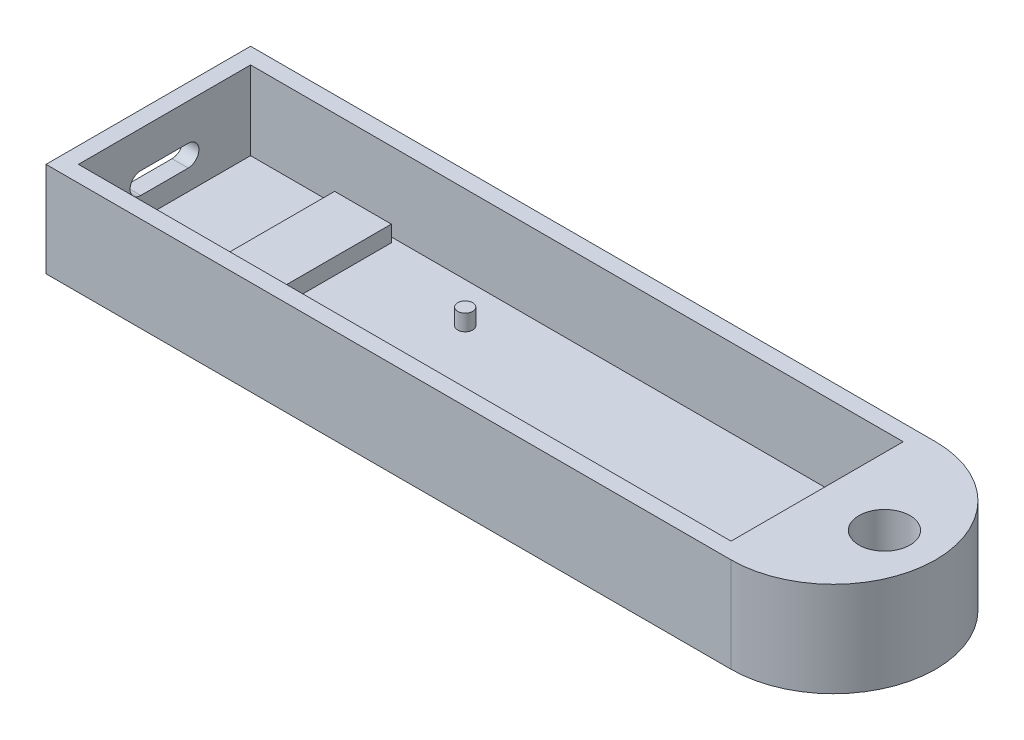
ISO-10303-21;
HEADER;
FILE_DESCRIPTION(('STEP AP214'),'2;1');
FILE_NAME('part.step','',(''),(''),'','','');
FILE_SCHEMA(('AUTOMOTIVE_DESIGN { 1 0 10303 214 1 1 1 1 }'));
ENDSEC;
DATA;
#1=APPLICATION_CONTEXT('core data for automotive mechanical design processes');
#2=APPLICATION_PROTOCOL_DEFINITION('international standard','automotive_design',2000,#1);
#3=PRODUCT_CONTEXT('',#1,'mechanical');
#4=PRODUCT('Part','Part','',(#3));
#5=PRODUCT_RELATED_PRODUCT_CATEGORY('part','',(#4));
#6=PRODUCT_DEFINITION_FORMATION('','',#4);
#7=PRODUCT_DEFINITION_CONTEXT('part definition',#1,'design');
#8=PRODUCT_DEFINITION('design','',#6,#7);
#9=PRODUCT_DEFINITION_SHAPE('','',#8);
#10=(LENGTH_UNIT() NAMED_UNIT(*) SI_UNIT(.MILLI.,.METRE.));
#11=(NAMED_UNIT(*) PLANE_ANGLE_UNIT() SI_UNIT($,.RADIAN.));
#12=(NAMED_UNIT(*) SI_UNIT($,.STERADIAN.) SOLID_ANGLE_UNIT());
#13=UNCERTAINTY_MEASURE_WITH_UNIT(LENGTH_MEASURE(1.E-05),#10,'distance_accuracy_value','');
#14=(GEOMETRIC_REPRESENTATION_CONTEXT(3) GLOBAL_UNCERTAINTY_ASSIGNED_CONTEXT((#13)) GLOBAL_UNIT_ASSIGNED_CONTEXT((#10,
#11,#12)) REPRESENTATION_CONTEXT('',''));
#15=CARTESIAN_POINT('',(0.,0.,0.));
#16=DIRECTION('',(0.,0.,1.));
#17=DIRECTION('',(1.,0.,0.));
#18=AXIS2_PLACEMENT_3D('',#15,#16,#17);
#19=CARTESIAN_POINT('',(-50.2599221877714,11.7,0.));
#20=DIRECTION('',(1.,0.,0.));
#21=DIRECTION('',(0.,0.,-1.));
#22=AXIS2_PLACEMENT_3D('',#19,#20,#21);
#23=PLANE('',#22);
#24=DIRECTION('',(0.,0.,1.));
#25=VECTOR('',#24,1.);
#26=CARTESIAN_POINT('',(-50.2599221877714,0.,0.));
#27=LINE('',#26,#25);
#28=CARTESIAN_POINT('',(-50.2599221877714,0.,-12.5001619157584));
#29=VERTEX_POINT('',#28);
#30=CARTESIAN_POINT('',(-50.2599221877714,0.,12.7498380842416));
#31=VERTEX_POINT('',#30);
#32=EDGE_CURVE('E205',#29,#31,#27,.T.);
#33=ORIENTED_EDGE('',*,*,#32,.T.);
#34=DIRECTION('',(0.,-1.,0.));
#35=VECTOR('',#34,1.);
#36=CARTESIAN_POINT('',(-50.2599221877714,11.7,12.7498380842416));
#37=LINE('',#36,#35);
#38=CARTESIAN_POINT('',(-50.2599221877714,11.7,12.7498380842416));
#39=VERTEX_POINT('',#38);
#40=EDGE_CURVE('E209',#39,#31,#37,.T.);
#41=ORIENTED_EDGE('',*,*,#40,.F.);
#42=DIRECTION('',(0.,0.,1.));
#43=VECTOR('',#42,1.);
#44=CARTESIAN_POINT('',(-50.2599221877714,11.7,0.));
#45=LINE('',#44,#43);
#46=CARTESIAN_POINT('',(-50.2599221877714,11.7,-12.5001619157584));
#47=VERTEX_POINT('',#46);
#48=EDGE_CURVE('E194',#47,#39,#45,.T.);
#49=ORIENTED_EDGE('',*,*,#48,.F.);
#50=DIRECTION('',(0.,-1.,0.));
#51=VECTOR('',#50,1.);
#52=CARTESIAN_POINT('',(-50.2599221877714,11.7,-12.5001619157584));
#53=LINE('',#52,#51);
#54=EDGE_CURVE('E212',#47,#29,#53,.T.);
#55=ORIENTED_EDGE('',*,*,#54,.T.);
#56=EDGE_LOOP('',(#33,#41,#49,#55));
#57=FACE_BOUND('',#56,.T.);
#58=CARTESIAN_POINT('',(-50.2599221877714,5.85,-2.80016191575837));
#59=DIRECTION('',(1.,0.,0.));
#60=DIRECTION('',(0.,0.,-1.));
#61=AXIS2_PLACEMENT_3D('',#58,#59,#60);
#62=CIRCLE('',#61,1.325);
#63=CARTESIAN_POINT('',(-50.2599221877714,7.175,-2.80016191575837));
#64=VERTEX_POINT('',#63);
#65=CARTESIAN_POINT('',(-50.2599221877714,4.525,-2.80016191575837));
#66=VERTEX_POINT('',#65);
#67=EDGE_CURVE('E160',#64,#66,#62,.F.);
#68=ORIENTED_EDGE('',*,*,#67,.F.);
#69=DIRECTION('',(0.,0.,1.));
#70=VECTOR('',#69,1.);
#71=CARTESIAN_POINT('',(-50.2599221877714,7.175,0.));
#72=LINE('',#71,#70);
#73=CARTESIAN_POINT('',(-50.2599221877714,7.175,3.04983808424164));
#74=VERTEX_POINT('',#73);
#75=EDGE_CURVE('E149',#64,#74,#72,.T.);
#76=ORIENTED_EDGE('',*,*,#75,.T.);
#77=CARTESIAN_POINT('',(-50.2599221877714,5.85,3.04983808424163));
#78=DIRECTION('',(1.,0.,0.));
#79=DIRECTION('',(0.,0.,-1.));
#80=AXIS2_PLACEMENT_3D('',#77,#78,#79);
#81=CIRCLE('',#80,1.325);
#82=CARTESIAN_POINT('',(-50.2599221877714,4.525,3.04983808424164));
#83=VERTEX_POINT('',#82);
#84=EDGE_CURVE('E154',#83,#74,#81,.F.);
#85=ORIENTED_EDGE('',*,*,#84,.F.);
#86=DIRECTION('',(0.,0.,1.));
#87=VECTOR('',#86,1.);
#88=CARTESIAN_POINT('',(-50.2599221877714,4.525,0.));
#89=LINE('',#88,#87);
#90=EDGE_CURVE('E165',#66,#83,#89,.T.);
#91=ORIENTED_EDGE('',*,*,#90,.F.);
#92=EDGE_LOOP('',(#68,#76,#85,#91));
#93=FACE_BOUND('',#92,.T.);
#94=ADVANCED_FACE('F39',(#57,#93),#23,.F.);
#95=CARTESIAN_POINT('',(-48.2599221877714,11.7,0.));
#96=DIRECTION('',(1.,0.,0.));
#97=DIRECTION('',(0.,0.,-1.));
#98=AXIS2_PLACEMENT_3D('',#95,#96,#97);
#99=PLANE('',#98);
#100=DIRECTION('',(0.,-1.,0.));
#101=VECTOR('',#100,1.);
#102=CARTESIAN_POINT('',(-48.2599221877714,11.7,10.7498380842416));
#103=LINE('',#102,#101);
#104=CARTESIAN_POINT('',(-48.2599221877714,11.7,10.7498380842416));
#105=VERTEX_POINT('',#104);
#106=CARTESIAN_POINT('',(-48.2599221877714,2.,10.7498380842416));
#107=VERTEX_POINT('',#106);
#108=EDGE_CURVE('E223',#105,#107,#103,.T.);
#109=ORIENTED_EDGE('',*,*,#108,.T.);
#110=DIRECTION('',(0.,0.,1.));
#111=VECTOR('',#110,1.);
#112=CARTESIAN_POINT('',(-48.2599221877714,2.,0.));
#113=LINE('',#112,#111);
#114=CARTESIAN_POINT('',(-48.2599221877714,2.,-10.5001619157584));
#115=VERTEX_POINT('',#114);
#116=EDGE_CURVE('E254',#115,#107,#113,.T.);
#117=ORIENTED_EDGE('',*,*,#116,.F.);
#118=DIRECTION('',(0.,-1.,0.));
#119=VECTOR('',#118,1.);
#120=CARTESIAN_POINT('',(-48.2599221877714,11.7,-10.5001619157584));
#121=LINE('',#120,#119);
#122=CARTESIAN_POINT('',(-48.2599221877714,11.7,-10.5001619157584));
#123=VERTEX_POINT('',#122);
#124=EDGE_CURVE('E198',#123,#115,#121,.T.);
#125=ORIENTED_EDGE('',*,*,#124,.F.);
#126=DIRECTION('',(0.,0.,1.));
#127=VECTOR('',#126,1.);
#128=CARTESIAN_POINT('',(-48.2599221877714,11.7,0.));
#129=LINE('',#128,#127);
#130=EDGE_CURVE('E183',#123,#105,#129,.T.);
#131=ORIENTED_EDGE('',*,*,#130,.T.);
#132=EDGE_LOOP('',(#109,#117,#125,#131));
#133=FACE_BOUND('',#132,.T.);
#134=DIRECTION('',(0.,0.,1.));
#135=VECTOR('',#134,1.);
#136=CARTESIAN_POINT('',(-48.2599221877714,7.175,0.));
#137=LINE('',#136,#135);
#138=CARTESIAN_POINT('',(-48.2599221877714,7.175,-2.80016191575837));
#139=VERTEX_POINT('',#138);
#140=CARTESIAN_POINT('',(-48.2599221877714,7.175,3.04983808424164));
#141=VERTEX_POINT('',#140);
#142=EDGE_CURVE('E295',#139,#141,#137,.T.);
#143=ORIENTED_EDGE('',*,*,#142,.F.);
#144=CARTESIAN_POINT('',(-48.2599221877714,5.85,-2.80016191575837));
#145=DIRECTION('',(1.,0.,0.));
#146=DIRECTION('',(0.,0.,-1.));
#147=AXIS2_PLACEMENT_3D('',#144,#145,#146);
#148=CIRCLE('',#147,1.325);
#149=CARTESIAN_POINT('',(-48.2599221877714,4.525,-2.80016191575837));
#150=VERTEX_POINT('',#149);
#151=EDGE_CURVE('E11',#139,#150,#148,.F.);
#152=ORIENTED_EDGE('',*,*,#151,.T.);
#153=DIRECTION('',(0.,0.,1.));
#154=VECTOR('',#153,1.);
#155=CARTESIAN_POINT('',(-48.2599221877714,4.525,0.));
#156=LINE('',#155,#154);
#157=CARTESIAN_POINT('',(-48.2599221877714,4.525,3.04983808424164));
#158=VERTEX_POINT('',#157);
#159=EDGE_CURVE('E47',#150,#158,#156,.T.);
#160=ORIENTED_EDGE('',*,*,#159,.T.);
#161=CARTESIAN_POINT('',(-48.2599221877714,5.85,3.04983808424163));
#162=DIRECTION('',(1.,0.,0.));
#163=DIRECTION('',(0.,0.,-1.));
#164=AXIS2_PLACEMENT_3D('',#161,#162,#163);
#165=CIRCLE('',#164,1.325);
#166=EDGE_CURVE('E297',#158,#141,#165,.F.);
#167=ORIENTED_EDGE('',*,*,#166,.T.);
#168=EDGE_LOOP('',(#143,#152,#160,#167));
#169=FACE_BOUND('',#168,.T.);
#170=ADVANCED_FACE('F301',(#133,#169),#99,.T.);
#171=CARTESIAN_POINT('',(0.,4.,10.1248380842416));
#172=DIRECTION('',(0.,0.,-1.));
#173=DIRECTION('',(-1.,0.,0.));
#174=AXIS2_PLACEMENT_3D('',#171,#172,#173);
#175=PLANE('',#174);
#176=DIRECTION('',(0.,-1.,0.));
#177=VECTOR('',#176,1.);
#178=CARTESIAN_POINT('',(-37.2599221877714,4.,10.1248380842416));
#179=LINE('',#178,#177);
#180=CARTESIAN_POINT('',(-37.2599221877714,4.,10.1248380842416));
#181=VERTEX_POINT('',#180);
#182=CARTESIAN_POINT('',(-37.2599221877714,2.,10.1248380842416));
#183=VERTEX_POINT('',#182);
#184=EDGE_CURVE('E284',#181,#183,#179,.T.);
#185=ORIENTED_EDGE('',*,*,#184,.T.);
#186=DIRECTION('',(1.,0.,0.));
#187=VECTOR('',#186,1.);
#188=CARTESIAN_POINT('',(0.,2.,10.1248380842416));
#189=LINE('',#188,#187);
#190=CARTESIAN_POINT('',(-30.2599221877714,2.,10.1248380842416));
#191=VERTEX_POINT('',#190);
#192=EDGE_CURVE('E259',#183,#191,#189,.T.);
#193=ORIENTED_EDGE('',*,*,#192,.T.);
#194=DIRECTION('',(0.,-1.,0.));
#195=VECTOR('',#194,1.);
#196=CARTESIAN_POINT('',(-30.2599221877714,4.,10.1248380842416));
#197=LINE('',#196,#195);
#198=CARTESIAN_POINT('',(-30.2599221877714,4.,10.1248380842416));
#199=VERTEX_POINT('',#198);
#200=EDGE_CURVE('E292',#199,#191,#197,.T.);
#201=ORIENTED_EDGE('',*,*,#200,.F.);
#202=DIRECTION('',(1.,0.,0.));
#203=VECTOR('',#202,1.);
#204=CARTESIAN_POINT('',(0.,4.,10.1248380842416));
#205=LINE('',#204,#203);
#206=EDGE_CURVE('E273',#181,#199,#205,.T.);
#207=ORIENTED_EDGE('',*,*,#206,.F.);
#208=EDGE_LOOP('',(#185,#193,#201,#207));
#209=FACE_BOUND('',#208,.T.);
#210=ADVANCED_FACE('F41',(#209),#175,.F.);
#211=CARTESIAN_POINT('',(-30.2599221877714,4.,0.));
#212=DIRECTION('',(-1.,0.,0.));
#213=DIRECTION('',(0.,0.,1.));
#214=AXIS2_PLACEMENT_3D('',#211,#212,#213);
#215=PLANE('',#214);
#216=ORIENTED_EDGE('',*,*,#200,.T.);
#217=DIRECTION('',(0.,0.,-1.));
#218=VECTOR('',#217,1.);
#219=CARTESIAN_POINT('',(-30.2599221877714,2.,0.));
#220=LINE('',#219,#218);
#221=CARTESIAN_POINT('',(-30.2599221877714,2.,-9.87516191575836));
#222=VERTEX_POINT('',#221);
#223=EDGE_CURVE('E257',#191,#222,#220,.T.);
#224=ORIENTED_EDGE('',*,*,#223,.T.);
#225=DIRECTION('',(0.,-1.,0.));
#226=VECTOR('',#225,1.);
#227=CARTESIAN_POINT('',(-30.2599221877714,4.,-9.87516191575836));
#228=LINE('',#227,#226);
#229=CARTESIAN_POINT('',(-30.2599221877714,4.,-9.87516191575836));
#230=VERTEX_POINT('',#229);
#231=EDGE_CURVE('E289',#230,#222,#228,.T.);
#232=ORIENTED_EDGE('',*,*,#231,.F.);
#233=DIRECTION('',(0.,0.,-1.));
#234=VECTOR('',#233,1.);
#235=CARTESIAN_POINT('',(-30.2599221877714,4.,0.));
#236=LINE('',#235,#234);
#237=EDGE_CURVE('E276',#199,#230,#236,.T.);
#238=ORIENTED_EDGE('',*,*,#237,.F.);
#239=EDGE_LOOP('',(#216,#224,#232,#238));
#240=FACE_BOUND('',#239,.T.);
#241=ADVANCED_FACE('F407',(#240),#215,.F.);
#242=CARTESIAN_POINT('',(0.,4.,-9.87516191575836));
#243=DIRECTION('',(0.,0.,-1.));
#244=DIRECTION('',(-1.,0.,0.));
#245=AXIS2_PLACEMENT_3D('',#242,#243,#244);
#246=PLANE('',#245);
#247=DIRECTION('',(1.,0.,0.));
#248=VECTOR('',#247,1.);
#249=CARTESIAN_POINT('',(0.,2.,-9.87516191575836));
#250=LINE('',#249,#248);
#251=CARTESIAN_POINT('',(-37.2599221877714,2.,-9.87516191575836));
#252=VERTEX_POINT('',#251);
#253=EDGE_CURVE('E264',#252,#222,#250,.T.);
#254=ORIENTED_EDGE('',*,*,#253,.F.);
#255=DIRECTION('',(0.,-1.,0.));
#256=VECTOR('',#255,1.);
#257=CARTESIAN_POINT('',(-37.2599221877714,4.,-9.87516191575836));
#258=LINE('',#257,#256);
#259=CARTESIAN_POINT('',(-37.2599221877714,4.,-9.87516191575836));
#260=VERTEX_POINT('',#259);
#261=EDGE_CURVE('E287',#260,#252,#258,.T.);
#262=ORIENTED_EDGE('',*,*,#261,.F.);
#263=DIRECTION('',(1.,0.,0.));
#264=VECTOR('',#263,1.);
#265=CARTESIAN_POINT('',(0.,4.,-9.87516191575836));
#266=LINE('',#265,#264);
#267=EDGE_CURVE('E278',#260,#230,#266,.T.);
#268=ORIENTED_EDGE('',*,*,#267,.T.);
#269=ORIENTED_EDGE('',*,*,#231,.T.);
#270=EDGE_LOOP('',(#254,#262,#268,#269));
#271=FACE_BOUND('',#270,.T.);
#272=ADVANCED_FACE('F404',(#271),#246,.T.);
#273=CARTESIAN_POINT('',(-37.2599221877714,4.,0.));
#274=DIRECTION('',(-1.,0.,0.));
#275=DIRECTION('',(0.,0.,1.));
#276=AXIS2_PLACEMENT_3D('',#273,#274,#275);
#277=PLANE('',#276);
#278=DIRECTION('',(0.,0.,-1.));
#279=VECTOR('',#278,1.);
#280=CARTESIAN_POINT('',(-37.2599221877714,2.,0.));
#281=LINE('',#280,#279);
#282=EDGE_CURVE('E261',#183,#252,#281,.T.);
#283=ORIENTED_EDGE('',*,*,#282,.F.);
#284=ORIENTED_EDGE('',*,*,#184,.F.);
#285=DIRECTION('',(0.,0.,-1.));
#286=VECTOR('',#285,1.);
#287=CARTESIAN_POINT('',(-37.2599221877714,4.,0.));
#288=LINE('',#287,#286);
#289=EDGE_CURVE('E281',#181,#260,#288,.T.);
#290=ORIENTED_EDGE('',*,*,#289,.T.);
#291=ORIENTED_EDGE('',*,*,#261,.T.);
#292=EDGE_LOOP('',(#283,#284,#290,#291));
#293=FACE_BOUND('',#292,.T.);
#294=ADVANCED_FACE('F396',(#293),#277,.T.);
#295=CARTESIAN_POINT('',(0.,4.,0.));
#296=DIRECTION('',(0.,1.,0.));
#297=DIRECTION('',(0.,0.,1.));
#298=AXIS2_PLACEMENT_3D('',#295,#296,#297);
#299=PLANE('',#298);
#300=ORIENTED_EDGE('',*,*,#206,.T.);
#301=ORIENTED_EDGE('',*,*,#237,.T.);
#302=ORIENTED_EDGE('',*,*,#267,.F.);
#303=ORIENTED_EDGE('',*,*,#289,.F.);
#304=EDGE_LOOP('',(#300,#301,#302,#303));
#305=FACE_BOUND('',#304,.T.);
#306=ADVANCED_FACE('F392',(#305),#299,.T.);
#307=CARTESIAN_POINT('',(0.,2.,0.));
#308=DIRECTION('',(0.,1.,0.));
#309=DIRECTION('',(0.,0.,1.));
#310=AXIS2_PLACEMENT_3D('',#307,#308,#309);
#311=PLANE('',#310);
#312=CARTESIAN_POINT('',(-16.8399221877714,2.,7.38135930462612));
#313=DIRECTION('',(0.,1.,0.));
#314=DIRECTION('',(0.,0.,1.));
#315=AXIS2_PLACEMENT_3D('',#312,#313,#314);
#316=CIRCLE('',#315,0.925000000000002);
#317=CARTESIAN_POINT('',(-16.8399221877714,2.,8.30635930462612));
#318=VERTEX_POINT('',#317);
#319=EDGE_CURVE('E241',#318,#318,#316,.T.);
#320=ORIENTED_EDGE('',*,*,#319,.F.);
#321=EDGE_LOOP('',(#320));
#322=FACE_BOUND('',#321,.T.);
#323=CARTESIAN_POINT('',(-16.8399221877714,2.,-5.57016191575837));
#324=DIRECTION('',(0.,1.,0.));
#325=DIRECTION('',(0.,0.,1.));
#326=AXIS2_PLACEMENT_3D('',#323,#324,#325);
#327=CIRCLE('',#326,0.925000000000002);
#328=CARTESIAN_POINT('',(-16.8399221877714,2.,-4.64516191575836));
#329=VERTEX_POINT('',#328);
#330=EDGE_CURVE('E244',#329,#329,#327,.T.);
#331=ORIENTED_EDGE('',*,*,#330,.F.);
#332=EDGE_LOOP('',(#331));
#333=FACE_BOUND('',#332,.T.);
#334=DIRECTION('',(1.,0.,0.));
#335=VECTOR('',#334,1.);
#336=CARTESIAN_POINT('',(0.,2.,10.7498380842416));
#337=LINE('',#336,#335);
#338=CARTESIAN_POINT('',(32.2900778122286,2.,10.7498380842416));
#339=VERTEX_POINT('',#338);
#340=EDGE_CURVE('E247',#107,#339,#337,.T.);
#341=ORIENTED_EDGE('',*,*,#340,.T.);
#342=DIRECTION('',(0.,0.,1.));
#343=VECTOR('',#342,1.);
#344=CARTESIAN_POINT('',(32.2900778122286,2.,0.));
#345=LINE('',#344,#343);
#346=CARTESIAN_POINT('',(32.2900778122286,2.,-10.5001619157584));
#347=VERTEX_POINT('',#346);
#348=EDGE_CURVE('E250',#347,#339,#345,.T.);
#349=ORIENTED_EDGE('',*,*,#348,.F.);
#350=DIRECTION('',(1.,0.,0.));
#351=VECTOR('',#350,1.);
#352=CARTESIAN_POINT('',(0.,2.,-10.5001619157584));
#353=LINE('',#352,#351);
#354=EDGE_CURVE('E252',#115,#347,#353,.T.);
#355=ORIENTED_EDGE('',*,*,#354,.F.);
#356=ORIENTED_EDGE('',*,*,#116,.T.);
#357=EDGE_LOOP('',(#341,#349,#355,#356));
#358=FACE_BOUND('',#357,.T.);
#359=ORIENTED_EDGE('',*,*,#223,.F.);
#360=ORIENTED_EDGE('',*,*,#192,.F.);
#361=ORIENTED_EDGE('',*,*,#282,.T.);
#362=ORIENTED_EDGE('',*,*,#253,.T.);
#363=EDGE_LOOP('',(#359,#360,#361,#362));
#364=FACE_BOUND('',#363,.T.);
#365=CARTESIAN_POINT('',(30.1600778122286,2.,-5.57016191575837));
#366=DIRECTION('',(0.,1.,0.));
#367=DIRECTION('',(0.,0.,1.));
#368=AXIS2_PLACEMENT_3D('',#365,#366,#367);
#369=CIRCLE('',#368,0.925000000000002);
#370=CARTESIAN_POINT('',(30.1600778122286,2.,-4.64516191575836));
#371=VERTEX_POINT('',#370);
#372=EDGE_CURVE('E267',#371,#371,#369,.T.);
#373=ORIENTED_EDGE('',*,*,#372,.F.);
#374=EDGE_LOOP('',(#373));
#375=FACE_BOUND('',#374,.T.);
#376=CARTESIAN_POINT('',(30.1600778122286,2.,7.38135930462612));
#377=DIRECTION('',(0.,1.,0.));
#378=DIRECTION('',(0.,0.,1.));
#379=AXIS2_PLACEMENT_3D('',#376,#377,#378);
#380=CIRCLE('',#379,0.925000000000002);
#381=CARTESIAN_POINT('',(30.1600778122286,2.,8.30635930462612));
#382=VERTEX_POINT('',#381);
#383=EDGE_CURVE('E270',#382,#382,#380,.T.);
#384=ORIENTED_EDGE('',*,*,#383,.F.);
#385=EDGE_LOOP('',(#384));
#386=FACE_BOUND('',#385,.T.);
#387=ADVANCED_FACE('F388',(#322,#333,#358,#364,#375,#386),#311,.T.);
#388=CARTESIAN_POINT('',(-16.8399221877714,4.,-5.57016191575837));
#389=DIRECTION('',(0.,-1.,0.));
#390=DIRECTION('',(0.,0.,-1.));
#391=AXIS2_PLACEMENT_3D('',#388,#389,#390);
#392=CYLINDRICAL_SURFACE('',#391,0.925000000000002);
#393=ORIENTED_EDGE('',*,*,#330,.T.);
#394=EDGE_LOOP('',(#393));
#395=FACE_BOUND('',#394,.T.);
#396=CARTESIAN_POINT('',(-16.8399221877714,4.,-5.57016191575837));
#397=DIRECTION('',(0.,1.,0.));
#398=DIRECTION('',(0.,0.,1.));
#399=AXIS2_PLACEMENT_3D('',#396,#397,#398);
#400=CIRCLE('',#399,0.925000000000002);
#401=CARTESIAN_POINT('',(-16.8399221877714,4.,-4.64516191575836));
#402=VERTEX_POINT('',#401);
#403=EDGE_CURVE('E238',#402,#402,#400,.T.);
#404=ORIENTED_EDGE('',*,*,#403,.F.);
#405=EDGE_LOOP('',(#404));
#406=FACE_BOUND('',#405,.T.);
#407=ADVANCED_FACE('F384',(#395,#406),#392,.T.);
#408=CARTESIAN_POINT('',(-16.8399221877714,4.,-5.57016191575837));
#409=DIRECTION('',(0.,1.,0.));
#410=DIRECTION('',(0.,0.,1.));
#411=AXIS2_PLACEMENT_3D('',#408,#409,#410);
#412=PLANE('',#411);
#413=ORIENTED_EDGE('',*,*,#403,.T.);
#414=EDGE_LOOP('',(#413));
#415=FACE_BOUND('',#414,.T.);
#416=ADVANCED_FACE('F377',(#415),#412,.T.);
#417=CARTESIAN_POINT('',(-16.8399221877714,4.,7.38135930462612));
#418=DIRECTION('',(0.,-1.,0.));
#419=DIRECTION('',(0.,0.,-1.));
#420=AXIS2_PLACEMENT_3D('',#417,#418,#419);
#421=CYLINDRICAL_SURFACE('',#420,0.925000000000002);
#422=ORIENTED_EDGE('',*,*,#319,.T.);
#423=EDGE_LOOP('',(#422));
#424=FACE_BOUND('',#423,.T.);
#425=CARTESIAN_POINT('',(-16.8399221877714,4.,7.38135930462612));
#426=DIRECTION('',(0.,1.,0.));
#427=DIRECTION('',(0.,0.,1.));
#428=AXIS2_PLACEMENT_3D('',#425,#426,#427);
#429=CIRCLE('',#428,0.925000000000002);
#430=CARTESIAN_POINT('',(-16.8399221877714,4.,8.30635930462612));
#431=VERTEX_POINT('',#430);
#432=EDGE_CURVE('E235',#431,#431,#429,.T.);
#433=ORIENTED_EDGE('',*,*,#432,.F.);
#434=EDGE_LOOP('',(#433));
#435=FACE_BOUND('',#434,.T.);
#436=ADVANCED_FACE('F374',(#424,#435),#421,.T.);
#437=CARTESIAN_POINT('',(-16.8399221877714,4.,7.38135930462612));
#438=DIRECTION('',(0.,1.,0.));
#439=DIRECTION('',(0.,0.,1.));
#440=AXIS2_PLACEMENT_3D('',#437,#438,#439);
#441=PLANE('',#440);
#442=ORIENTED_EDGE('',*,*,#432,.T.);
#443=EDGE_LOOP('',(#442));
#444=FACE_BOUND('',#443,.T.);
#445=ADVANCED_FACE('F369',(#444),#441,.T.);
#446=CARTESIAN_POINT('',(30.1600778122286,4.,7.38135930462612));
#447=DIRECTION('',(0.,-1.,0.));
#448=DIRECTION('',(0.,0.,-1.));
#449=AXIS2_PLACEMENT_3D('',#446,#447,#448);
#450=CYLINDRICAL_SURFACE('',#449,0.925000000000002);
#451=ORIENTED_EDGE('',*,*,#383,.T.);
#452=EDGE_LOOP('',(#451));
#453=FACE_BOUND('',#452,.T.);
#454=CARTESIAN_POINT('',(30.1600778122286,4.,7.38135930462612));
#455=DIRECTION('',(0.,1.,0.));
#456=DIRECTION('',(0.,0.,1.));
#457=AXIS2_PLACEMENT_3D('',#454,#455,#456);
#458=CIRCLE('',#457,0.925000000000002);
#459=CARTESIAN_POINT('',(30.1600778122286,4.,8.30635930462612));
#460=VERTEX_POINT('',#459);
#461=EDGE_CURVE('E232',#460,#460,#458,.T.);
#462=ORIENTED_EDGE('',*,*,#461,.F.);
#463=EDGE_LOOP('',(#462));
#464=FACE_BOUND('',#463,.T.);
#465=ADVANCED_FACE('F366',(#453,#464),#450,.T.);
#466=CARTESIAN_POINT('',(30.1600778122286,4.,7.38135930462612));
#467=DIRECTION('',(0.,1.,0.));
#468=DIRECTION('',(0.,0.,1.));
#469=AXIS2_PLACEMENT_3D('',#466,#467,#468);
#470=PLANE('',#469);
#471=ORIENTED_EDGE('',*,*,#461,.T.);
#472=EDGE_LOOP('',(#471));
#473=FACE_BOUND('',#472,.T.);
#474=ADVANCED_FACE('F361',(#473),#470,.T.);
#475=CARTESIAN_POINT('',(30.1600778122286,4.,-5.57016191575837));
#476=DIRECTION('',(0.,-1.,0.));
#477=DIRECTION('',(0.,0.,-1.));
#478=AXIS2_PLACEMENT_3D('',#475,#476,#477);
#479=CYLINDRICAL_SURFACE('',#478,0.925000000000002);
#480=ORIENTED_EDGE('',*,*,#372,.T.);
#481=EDGE_LOOP('',(#480));
#482=FACE_BOUND('',#481,.T.);
#483=CARTESIAN_POINT('',(30.1600778122286,4.,-5.57016191575837));
#484=DIRECTION('',(0.,1.,0.));
#485=DIRECTION('',(0.,0.,1.));
#486=AXIS2_PLACEMENT_3D('',#483,#484,#485);
#487=CIRCLE('',#486,0.925000000000002);
#488=CARTESIAN_POINT('',(30.1600778122286,4.,-4.64516191575836));
#489=VERTEX_POINT('',#488);
#490=EDGE_CURVE('E220',#489,#489,#487,.T.);
#491=ORIENTED_EDGE('',*,*,#490,.F.);
#492=EDGE_LOOP('',(#491));
#493=FACE_BOUND('',#492,.T.);
#494=ADVANCED_FACE('F358',(#482,#493),#479,.T.);
#495=CARTESIAN_POINT('',(30.1600778122286,4.,-5.57016191575837));
#496=DIRECTION('',(0.,1.,0.));
#497=DIRECTION('',(0.,0.,1.));
#498=AXIS2_PLACEMENT_3D('',#495,#496,#497);
#499=PLANE('',#498);
#500=ORIENTED_EDGE('',*,*,#490,.T.);
#501=EDGE_LOOP('',(#500));
#502=FACE_BOUND('',#501,.T.);
#503=ADVANCED_FACE('F344',(#502),#499,.T.);
#504=CARTESIAN_POINT('',(0.,11.7,12.7498380842416));
#505=DIRECTION('',(0.,0.,-1.));
#506=DIRECTION('',(-1.,0.,0.));
#507=AXIS2_PLACEMENT_3D('',#504,#505,#506);
#508=PLANE('',#507);
#509=DIRECTION('',(1.,0.,0.));
#510=VECTOR('',#509,1.);
#511=CARTESIAN_POINT('',(0.,0.,12.7498380842416));
#512=LINE('',#511,#510);
#513=CARTESIAN_POINT('',(34.2900778122286,0.,12.7498380842416));
#514=VERTEX_POINT('',#513);
#515=EDGE_CURVE('E166',#31,#514,#512,.T.);
#516=ORIENTED_EDGE('',*,*,#515,.T.);
#517=DIRECTION('',(0.,-1.,0.));
#518=VECTOR('',#517,1.);
#519=CARTESIAN_POINT('',(34.2900778122286,11.7,12.7498380842416));
#520=LINE('',#519,#518);
#521=CARTESIAN_POINT('',(34.2900778122286,11.7,12.7498380842416));
#522=VERTEX_POINT('',#521);
#523=EDGE_CURVE('E217',#522,#514,#520,.T.);
#524=ORIENTED_EDGE('',*,*,#523,.F.);
#525=DIRECTION('',(1.,0.,0.));
#526=VECTOR('',#525,1.);
#527=CARTESIAN_POINT('',(0.,11.7,12.7498380842416));
#528=LINE('',#527,#526);
#529=EDGE_CURVE('E186',#39,#522,#528,.T.);
#530=ORIENTED_EDGE('',*,*,#529,.F.);
#531=ORIENTED_EDGE('',*,*,#40,.T.);
#532=EDGE_LOOP('',(#516,#524,#530,#531));
#533=FACE_BOUND('',#532,.T.);
#534=ADVANCED_FACE('F341',(#533),#508,.F.);
#535=CARTESIAN_POINT('',(34.2900778122286,11.7,0.124838084241635));
#536=DIRECTION('',(0.,-1.,0.));
#537=DIRECTION('',(0.,0.,-1.));
#538=AXIS2_PLACEMENT_3D('',#535,#536,#537);
#539=CYLINDRICAL_SURFACE('',#538,12.625);
#540=CARTESIAN_POINT('',(34.2900778122286,0.,0.124838084241635));
#541=DIRECTION('',(0.,1.,0.));
#542=DIRECTION('',(0.,0.,1.));
#543=AXIS2_PLACEMENT_3D('',#540,#541,#542);
#544=CIRCLE('',#543,12.625);
#545=CARTESIAN_POINT('',(34.2900778122286,0.,-12.5001619157584));
#546=VERTEX_POINT('',#545);
#547=EDGE_CURVE('E169',#514,#546,#544,.T.);
#548=ORIENTED_EDGE('',*,*,#547,.T.);
#549=DIRECTION('',(0.,-1.,0.));
#550=VECTOR('',#549,1.);
#551=CARTESIAN_POINT('',(34.2900778122286,11.7,-12.5001619157584));
#552=LINE('',#551,#550);
#553=CARTESIAN_POINT('',(34.2900778122286,11.7,-12.5001619157584));
#554=VERTEX_POINT('',#553);
#555=EDGE_CURVE('E215',#554,#546,#552,.T.);
#556=ORIENTED_EDGE('',*,*,#555,.F.);
#557=CARTESIAN_POINT('',(34.2900778122286,11.7,0.124838084241635));
#558=DIRECTION('',(0.,1.,0.));
#559=DIRECTION('',(0.,0.,1.));
#560=AXIS2_PLACEMENT_3D('',#557,#558,#559);
#561=CIRCLE('',#560,12.625);
#562=EDGE_CURVE('E189',#522,#554,#561,.T.);
#563=ORIENTED_EDGE('',*,*,#562,.F.);
#564=ORIENTED_EDGE('',*,*,#523,.T.);
#565=EDGE_LOOP('',(#548,#556,#563,#564));
#566=FACE_BOUND('',#565,.T.);
#567=ADVANCED_FACE('F337',(#566),#539,.T.);
#568=CARTESIAN_POINT('',(0.,11.7,-12.5001619157584));
#569=DIRECTION('',(0.,0.,-1.));
#570=DIRECTION('',(-1.,0.,0.));
#571=AXIS2_PLACEMENT_3D('',#568,#569,#570);
#572=PLANE('',#571);
#573=DIRECTION('',(1.,0.,0.));
#574=VECTOR('',#573,1.);
#575=CARTESIAN_POINT('',(0.,0.,-12.5001619157584));
#576=LINE('',#575,#574);
#577=EDGE_CURVE('E202',#29,#546,#576,.T.);
#578=ORIENTED_EDGE('',*,*,#577,.F.);
#579=ORIENTED_EDGE('',*,*,#54,.F.);
#580=DIRECTION('',(1.,0.,0.));
#581=VECTOR('',#580,1.);
#582=CARTESIAN_POINT('',(0.,11.7,-12.5001619157584));
#583=LINE('',#582,#581);
#584=EDGE_CURVE('E191',#47,#554,#583,.T.);
#585=ORIENTED_EDGE('',*,*,#584,.T.);
#586=ORIENTED_EDGE('',*,*,#555,.T.);
#587=EDGE_LOOP('',(#578,#579,#585,#586));
#588=FACE_BOUND('',#587,.T.);
#589=ADVANCED_FACE('F333',(#588),#572,.T.);
#590=CARTESIAN_POINT('',(0.,11.7,-10.5001619157584));
#591=DIRECTION('',(0.,0.,-1.));
#592=DIRECTION('',(-1.,0.,0.));
#593=AXIS2_PLACEMENT_3D('',#590,#591,#592);
#594=PLANE('',#593);
#595=ORIENTED_EDGE('',*,*,#354,.T.);
#596=DIRECTION('',(0.,-1.,0.));
#597=VECTOR('',#596,1.);
#598=CARTESIAN_POINT('',(32.2900778122286,11.7,-10.5001619157584));
#599=LINE('',#598,#597);
#600=CARTESIAN_POINT('',(32.2900778122286,11.7,-10.5001619157584));
#601=VERTEX_POINT('',#600);
#602=EDGE_CURVE('E213',#601,#347,#599,.T.);
#603=ORIENTED_EDGE('',*,*,#602,.F.);
#604=DIRECTION('',(1.,0.,0.));
#605=VECTOR('',#604,1.);
#606=CARTESIAN_POINT('',(0.,11.7,-10.5001619157584));
#607=LINE('',#606,#605);
#608=EDGE_CURVE('E174',#123,#601,#607,.T.);
#609=ORIENTED_EDGE('',*,*,#608,.F.);
#610=ORIENTED_EDGE('',*,*,#124,.T.);
#611=EDGE_LOOP('',(#595,#603,#609,#610));
#612=FACE_BOUND('',#611,.T.);
#613=ADVANCED_FACE('F336',(#612),#594,.F.);
#614=CARTESIAN_POINT('',(32.2900778122286,11.7,0.));
#615=DIRECTION('',(1.,0.,0.));
#616=DIRECTION('',(0.,0.,-1.));
#617=AXIS2_PLACEMENT_3D('',#614,#615,#616);
#618=PLANE('',#617);
#619=ORIENTED_EDGE('',*,*,#348,.T.);
#620=DIRECTION('',(0.,-1.,0.));
#621=VECTOR('',#620,1.);
#622=CARTESIAN_POINT('',(32.2900778122286,11.7,10.7498380842416));
#623=LINE('',#622,#621);
#624=CARTESIAN_POINT('',(32.2900778122286,11.7,10.7498380842416));
#625=VERTEX_POINT('',#624);
#626=EDGE_CURVE('E225',#625,#339,#623,.T.);
#627=ORIENTED_EDGE('',*,*,#626,.F.);
#628=DIRECTION('',(0.,0.,1.));
#629=VECTOR('',#628,1.);
#630=CARTESIAN_POINT('',(32.2900778122286,11.7,0.));
#631=LINE('',#630,#629);
#632=EDGE_CURVE('E177',#601,#625,#631,.T.);
#633=ORIENTED_EDGE('',*,*,#632,.F.);
#634=ORIENTED_EDGE('',*,*,#602,.T.);
#635=EDGE_LOOP('',(#619,#627,#633,#634));
#636=FACE_BOUND('',#635,.T.);
#637=ADVANCED_FACE('F350',(#636),#618,.F.);
#638=CARTESIAN_POINT('',(0.,11.7,10.7498380842416));
#639=DIRECTION('',(0.,0.,-1.));
#640=DIRECTION('',(-1.,0.,0.));
#641=AXIS2_PLACEMENT_3D('',#638,#639,#640);
#642=PLANE('',#641);
#643=ORIENTED_EDGE('',*,*,#626,.T.);
#644=ORIENTED_EDGE('',*,*,#340,.F.);
#645=ORIENTED_EDGE('',*,*,#108,.F.);
#646=DIRECTION('',(1.,0.,0.));
#647=VECTOR('',#646,1.);
#648=CARTESIAN_POINT('',(0.,11.7,10.7498380842416));
#649=LINE('',#648,#647);
#650=EDGE_CURVE('E180',#105,#625,#649,.T.);
#651=ORIENTED_EDGE('',*,*,#650,.T.);
#652=EDGE_LOOP('',(#643,#644,#645,#651));
#653=FACE_BOUND('',#652,.T.);
#654=ADVANCED_FACE('F347',(#653),#642,.T.);
#655=CARTESIAN_POINT('',(40.6000778122286,11.7,0.124838084241635));
#656=DIRECTION('',(0.,-1.,0.));
#657=DIRECTION('',(0.,0.,-1.));
#658=AXIS2_PLACEMENT_3D('',#655,#656,#657);
#659=CYLINDRICAL_SURFACE('',#658,3.155);
#660=CARTESIAN_POINT('',(40.6000778122286,11.7,0.124838084241635));
#661=DIRECTION('',(0.,1.,0.));
#662=DIRECTION('',(0.,0.,1.));
#663=AXIS2_PLACEMENT_3D('',#660,#661,#662);
#664=CIRCLE('',#663,3.155);
#665=CARTESIAN_POINT('',(40.6000778122286,11.7,3.27983808424163));
#666=VERTEX_POINT('',#665);
#667=EDGE_CURVE('E196',#666,#666,#664,.T.);
#668=ORIENTED_EDGE('',*,*,#667,.T.);
#669=EDGE_LOOP('',(#668));
#670=FACE_BOUND('',#669,.T.);
#671=CARTESIAN_POINT('',(40.6000778122286,0.,0.124838084241635));
#672=DIRECTION('',(0.,1.,0.));
#673=DIRECTION('',(0.,0.,1.));
#674=AXIS2_PLACEMENT_3D('',#671,#672,#673);
#675=CIRCLE('',#674,3.155);
#676=CARTESIAN_POINT('',(40.6000778122286,0.,3.27983808424163));
#677=VERTEX_POINT('',#676);
#678=EDGE_CURVE('E178',#677,#677,#675,.T.);
#679=ORIENTED_EDGE('',*,*,#678,.F.);
#680=EDGE_LOOP('',(#679));
#681=FACE_BOUND('',#680,.T.);
#682=ADVANCED_FACE('F331',(#670,#681),#659,.F.);
#683=CARTESIAN_POINT('',(0.,11.7,0.));
#684=DIRECTION('',(0.,1.,0.));
#685=DIRECTION('',(0.,0.,1.));
#686=AXIS2_PLACEMENT_3D('',#683,#684,#685);
#687=PLANE('',#686);
#688=ORIENTED_EDGE('',*,*,#608,.T.);
#689=ORIENTED_EDGE('',*,*,#632,.T.);
#690=ORIENTED_EDGE('',*,*,#650,.F.);
#691=ORIENTED_EDGE('',*,*,#130,.F.);
#692=EDGE_LOOP('',(#688,#689,#690,#691));
#693=FACE_BOUND('',#692,.T.);
#694=ORIENTED_EDGE('',*,*,#529,.T.);
#695=ORIENTED_EDGE('',*,*,#562,.T.);
#696=ORIENTED_EDGE('',*,*,#584,.F.);
#697=ORIENTED_EDGE('',*,*,#48,.T.);
#698=EDGE_LOOP('',(#694,#695,#696,#697));
#699=FACE_BOUND('',#698,.T.);
#700=ORIENTED_EDGE('',*,*,#667,.F.);
#701=EDGE_LOOP('',(#700));
#702=FACE_BOUND('',#701,.T.);
#703=ADVANCED_FACE('F400',(#693,#699,#702),#687,.T.);
#704=CARTESIAN_POINT('',(0.,0.,0.));
#705=DIRECTION('',(0.,1.,0.));
#706=DIRECTION('',(0.,0.,1.));
#707=AXIS2_PLACEMENT_3D('',#704,#705,#706);
#708=PLANE('',#707);
#709=ORIENTED_EDGE('',*,*,#515,.F.);
#710=ORIENTED_EDGE('',*,*,#32,.F.);
#711=ORIENTED_EDGE('',*,*,#577,.T.);
#712=ORIENTED_EDGE('',*,*,#547,.F.);
#713=EDGE_LOOP('',(#709,#710,#711,#712));
#714=FACE_BOUND('',#713,.T.);
#715=ORIENTED_EDGE('',*,*,#678,.T.);
#716=EDGE_LOOP('',(#715));
#717=FACE_BOUND('',#716,.T.);
#718=ADVANCED_FACE('F398',(#714,#717),#708,.F.);
#719=CARTESIAN_POINT('',(-55.1099221877714,5.85,-2.80016191575837));
#720=DIRECTION('',(1.,0.,0.));
#721=DIRECTION('',(0.,0.,-1.));
#722=AXIS2_PLACEMENT_3D('',#719,#720,#721);
#723=CYLINDRICAL_SURFACE('',#722,1.325);
#724=ORIENTED_EDGE('',*,*,#67,.T.);
#725=DIRECTION('',(1.,0.,0.));
#726=VECTOR('',#725,1.);
#727=CARTESIAN_POINT('',(-55.1099221877714,4.525,-2.80016191575837));
#728=LINE('',#727,#726);
#729=EDGE_CURVE('E155',#66,#150,#728,.T.);
#730=ORIENTED_EDGE('',*,*,#729,.T.);
#731=ORIENTED_EDGE('',*,*,#151,.F.);
#732=DIRECTION('',(1.,0.,0.));
#733=VECTOR('',#732,1.);
#734=CARTESIAN_POINT('',(-55.1099221877714,7.175,-2.80016191575837));
#735=LINE('',#734,#733);
#736=EDGE_CURVE('E59',#64,#139,#735,.T.);
#737=ORIENTED_EDGE('',*,*,#736,.F.);
#738=EDGE_LOOP('',(#724,#730,#731,#737));
#739=FACE_BOUND('',#738,.T.);
#740=ADVANCED_FACE('F158',(#739),#723,.F.);
#741=CARTESIAN_POINT('',(-55.1099221877714,4.525,-2.80016191575837));
#742=DIRECTION('',(0.,1.,0.));
#743=DIRECTION('',(0.,0.,1.));
#744=AXIS2_PLACEMENT_3D('',#741,#742,#743);
#745=PLANE('',#744);
#746=ORIENTED_EDGE('',*,*,#90,.T.);
#747=DIRECTION('',(1.,0.,0.));
#748=VECTOR('',#747,1.);
#749=CARTESIAN_POINT('',(-55.1099221877714,4.525,3.04983808424164));
#750=LINE('',#749,#748);
#751=EDGE_CURVE('E306',#83,#158,#750,.T.);
#752=ORIENTED_EDGE('',*,*,#751,.T.);
#753=ORIENTED_EDGE('',*,*,#159,.F.);
#754=ORIENTED_EDGE('',*,*,#729,.F.);
#755=EDGE_LOOP('',(#746,#752,#753,#754));
#756=FACE_BOUND('',#755,.T.);
#757=ADVANCED_FACE('F304',(#756),#745,.T.);
#758=CARTESIAN_POINT('',(-55.1099221877714,5.85,3.04983808424163));
#759=DIRECTION('',(1.,0.,0.));
#760=DIRECTION('',(0.,0.,-1.));
#761=AXIS2_PLACEMENT_3D('',#758,#759,#760);
#762=CYLINDRICAL_SURFACE('',#761,1.325);
#763=ORIENTED_EDGE('',*,*,#84,.T.);
#764=DIRECTION('',(1.,0.,0.));
#765=VECTOR('',#764,1.);
#766=CARTESIAN_POINT('',(-55.1099221877714,7.175,3.04983808424164));
#767=LINE('',#766,#765);
#768=EDGE_CURVE('E54',#74,#141,#767,.T.);
#769=ORIENTED_EDGE('',*,*,#768,.T.);
#770=ORIENTED_EDGE('',*,*,#166,.F.);
#771=ORIENTED_EDGE('',*,*,#751,.F.);
#772=EDGE_LOOP('',(#763,#769,#770,#771));
#773=FACE_BOUND('',#772,.T.);
#774=ADVANCED_FACE('F311',(#773),#762,.F.);
#775=CARTESIAN_POINT('',(-55.1099221877714,7.175,-2.80016191575837));
#776=DIRECTION('',(0.,1.,0.));
#777=DIRECTION('',(0.,0.,1.));
#778=AXIS2_PLACEMENT_3D('',#775,#776,#777);
#779=PLANE('',#778);
#780=ORIENTED_EDGE('',*,*,#736,.T.);
#781=ORIENTED_EDGE('',*,*,#142,.T.);
#782=ORIENTED_EDGE('',*,*,#768,.F.);
#783=ORIENTED_EDGE('',*,*,#75,.F.);
#784=EDGE_LOOP('',(#780,#781,#782,#783));
#785=FACE_BOUND('',#784,.T.);
#786=ADVANCED_FACE('F150',(#785),#779,.F.);
#787=CLOSED_SHELL('',(#94,#170,#210,#241,#272,#294,#306,#387,#407,#416,#436,#445,#465,#474,#494,
#503,#534,#567,#589,#613,#637,#654,#682,#703,#718,#740,#757,#774,#786));
#788=MANIFOLD_SOLID_BREP('B2',#787);
#789=ADVANCED_BREP_SHAPE_REPRESENTATION('',(#18,#788),#14);
#790=SHAPE_DEFINITION_REPRESENTATION(#9,#789);
ENDSEC;
END-ISO-10303-21;
